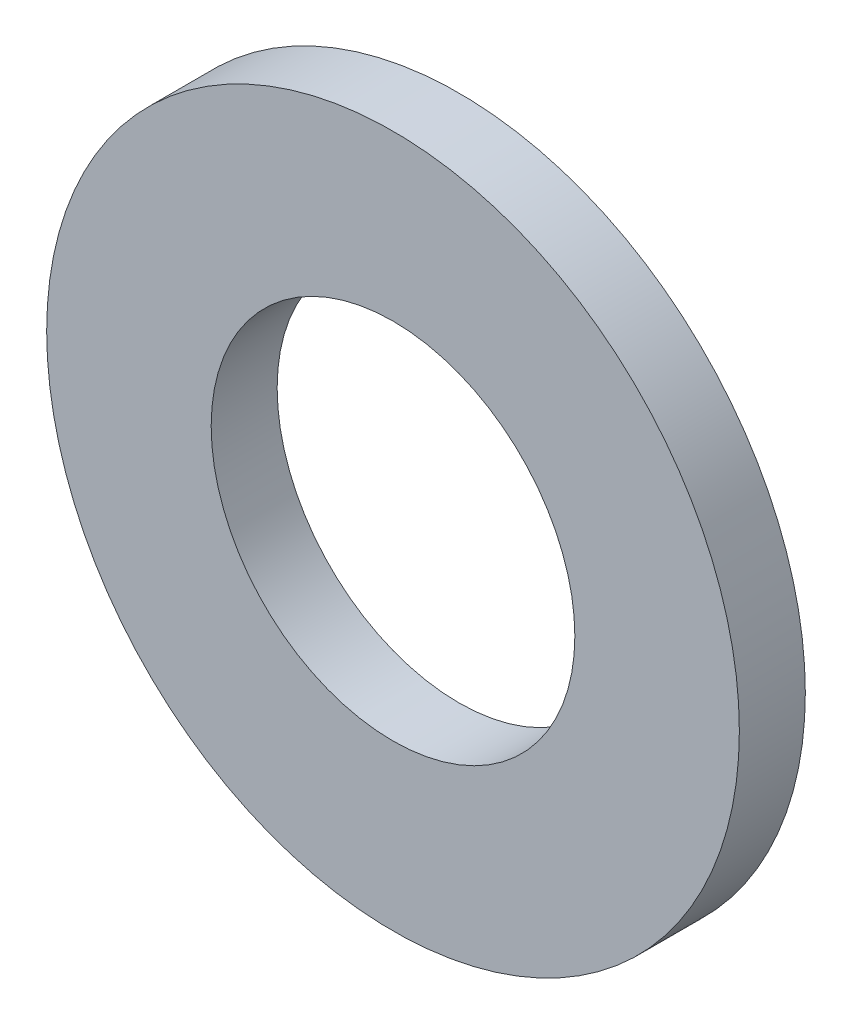
ISO-10303-21;
HEADER;
FILE_DESCRIPTION(('STEP AP214'),'2;1');
FILE_NAME('part.step','',(''),(''),'','','');
FILE_SCHEMA(('AUTOMOTIVE_DESIGN { 1 0 10303 214 1 1 1 1 }'));
ENDSEC;
DATA;
#1=APPLICATION_CONTEXT('core data for automotive mechanical design processes');
#2=APPLICATION_PROTOCOL_DEFINITION('international standard','automotive_design',2000,#1);
#3=PRODUCT_CONTEXT('',#1,'mechanical');
#4=PRODUCT('Part','Part','',(#3));
#5=PRODUCT_RELATED_PRODUCT_CATEGORY('part','',(#4));
#6=PRODUCT_DEFINITION_FORMATION('','',#4);
#7=PRODUCT_DEFINITION_CONTEXT('part definition',#1,'design');
#8=PRODUCT_DEFINITION('design','',#6,#7);
#9=PRODUCT_DEFINITION_SHAPE('','',#8);
#10=(LENGTH_UNIT() NAMED_UNIT(*) SI_UNIT(.MILLI.,.METRE.));
#11=(NAMED_UNIT(*) PLANE_ANGLE_UNIT() SI_UNIT($,.RADIAN.));
#12=(NAMED_UNIT(*) SI_UNIT($,.STERADIAN.) SOLID_ANGLE_UNIT());
#13=UNCERTAINTY_MEASURE_WITH_UNIT(LENGTH_MEASURE(1.E-05),#10,'distance_accuracy_value','');
#14=(GEOMETRIC_REPRESENTATION_CONTEXT(3) GLOBAL_UNCERTAINTY_ASSIGNED_CONTEXT((#13)) GLOBAL_UNIT_ASSIGNED_CONTEXT((#10,
#11,#12)) REPRESENTATION_CONTEXT('',''));
#15=CARTESIAN_POINT('',(0.,0.,0.));
#16=DIRECTION('',(0.,0.,1.));
#17=DIRECTION('',(1.,0.,0.));
#18=AXIS2_PLACEMENT_3D('',#15,#16,#17);
#19=CARTESIAN_POINT('',(0.,0.,-0.381));
#20=DIRECTION('',(0.,0.,1.));
#21=DIRECTION('',(1.,0.,0.));
#22=AXIS2_PLACEMENT_3D('',#19,#20,#21);
#23=PLANE('',#22);
#24=CARTESIAN_POINT('',(0.,0.,-0.381));
#25=DIRECTION('',(0.,0.,-1.));
#26=DIRECTION('',(-1.,0.,0.));
#27=AXIS2_PLACEMENT_3D('',#24,#25,#26);
#28=CIRCLE('',#27,2.1);
#29=CARTESIAN_POINT('',(-2.1,0.,-0.381));
#30=VERTEX_POINT('',#29);
#31=EDGE_CURVE('E26',#30,#30,#28,.F.);
#32=ORIENTED_EDGE('',*,*,#31,.T.);
#33=EDGE_LOOP('',(#32));
#34=FACE_BOUND('',#33,.T.);
#35=CARTESIAN_POINT('',(0.,0.,-0.381));
#36=DIRECTION('',(0.,0.,-1.));
#37=DIRECTION('',(-1.,0.,0.));
#38=AXIS2_PLACEMENT_3D('',#35,#36,#37);
#39=CIRCLE('',#38,4.);
#40=CARTESIAN_POINT('',(-4.,0.,-0.381));
#41=VERTEX_POINT('',#40);
#42=EDGE_CURVE('E17',#41,#41,#39,.F.);
#43=ORIENTED_EDGE('',*,*,#42,.F.);
#44=EDGE_LOOP('',(#43));
#45=FACE_BOUND('',#44,.T.);
#46=ADVANCED_FACE('F14',(#34,#45),#23,.F.);
#47=CARTESIAN_POINT('',(0.,0.,0.381));
#48=DIRECTION('',(0.,0.,-1.));
#49=DIRECTION('',(-1.,0.,0.));
#50=AXIS2_PLACEMENT_3D('',#47,#48,#49);
#51=CYLINDRICAL_SURFACE('',#50,4.);
#52=ORIENTED_EDGE('',*,*,#42,.T.);
#53=EDGE_LOOP('',(#52));
#54=FACE_BOUND('',#53,.T.);
#55=CARTESIAN_POINT('',(0.,0.,0.381));
#56=DIRECTION('',(0.,0.,-1.));
#57=DIRECTION('',(-1.,0.,0.));
#58=AXIS2_PLACEMENT_3D('',#55,#56,#57);
#59=CIRCLE('',#58,4.);
#60=CARTESIAN_POINT('',(-4.,0.,0.381));
#61=VERTEX_POINT('',#60);
#62=EDGE_CURVE('E21',#61,#61,#59,.F.);
#63=ORIENTED_EDGE('',*,*,#62,.F.);
#64=EDGE_LOOP('',(#63));
#65=FACE_BOUND('',#64,.T.);
#66=ADVANCED_FACE('F34',(#54,#65),#51,.T.);
#67=CARTESIAN_POINT('',(0.,0.,0.381));
#68=DIRECTION('',(0.,0.,-1.));
#69=DIRECTION('',(-1.,0.,0.));
#70=AXIS2_PLACEMENT_3D('',#67,#68,#69);
#71=CYLINDRICAL_SURFACE('',#70,2.1);
#72=CARTESIAN_POINT('',(0.,0.,0.381));
#73=DIRECTION('',(0.,0.,-1.));
#74=DIRECTION('',(-1.,0.,0.));
#75=AXIS2_PLACEMENT_3D('',#72,#73,#74);
#76=CIRCLE('',#75,2.1);
#77=CARTESIAN_POINT('',(-2.1,0.,0.381));
#78=VERTEX_POINT('',#77);
#79=EDGE_CURVE('E10',#78,#78,#76,.T.);
#80=ORIENTED_EDGE('',*,*,#79,.F.);
#81=EDGE_LOOP('',(#80));
#82=FACE_BOUND('',#81,.T.);
#83=ORIENTED_EDGE('',*,*,#31,.F.);
#84=EDGE_LOOP('',(#83));
#85=FACE_BOUND('',#84,.T.);
#86=ADVANCED_FACE('F42',(#82,#85),#71,.F.);
#87=CARTESIAN_POINT('',(0.,0.,0.381));
#88=DIRECTION('',(0.,0.,1.));
#89=DIRECTION('',(1.,0.,0.));
#90=AXIS2_PLACEMENT_3D('',#87,#88,#89);
#91=PLANE('',#90);
#92=ORIENTED_EDGE('',*,*,#79,.T.);
#93=EDGE_LOOP('',(#92));
#94=FACE_BOUND('',#93,.T.);
#95=ORIENTED_EDGE('',*,*,#62,.T.);
#96=EDGE_LOOP('',(#95));
#97=FACE_BOUND('',#96,.T.);
#98=ADVANCED_FACE('F43',(#94,#97),#91,.T.);
#99=CLOSED_SHELL('',(#46,#66,#86,#98));
#100=MANIFOLD_SOLID_BREP('B1',#99);
#101=ADVANCED_BREP_SHAPE_REPRESENTATION('',(#18,#100),#14);
#102=SHAPE_DEFINITION_REPRESENTATION(#9,#101);
ENDSEC;
END-ISO-10303-21;
